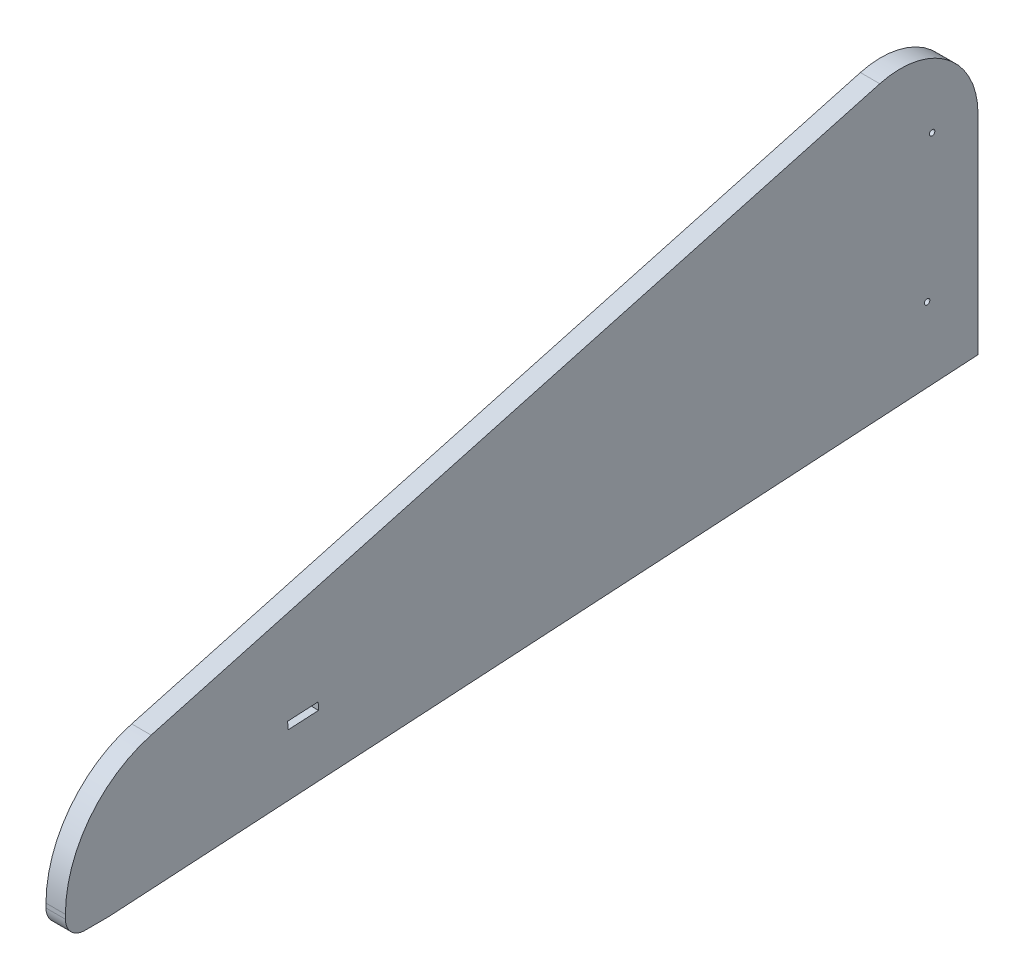
ISO-10303-21;
HEADER;
FILE_DESCRIPTION(('STEP AP214'),'2;1');
FILE_NAME('part.step','',(''),(''),'','','');
FILE_SCHEMA(('AUTOMOTIVE_DESIGN { 1 0 10303 214 1 1 1 1 }'));
ENDSEC;
DATA;
#1=APPLICATION_CONTEXT('core data for automotive mechanical design processes');
#2=APPLICATION_PROTOCOL_DEFINITION('international standard','automotive_design',2000,#1);
#3=PRODUCT_CONTEXT('',#1,'mechanical');
#4=PRODUCT('Part','Part','',(#3));
#5=PRODUCT_RELATED_PRODUCT_CATEGORY('part','',(#4));
#6=PRODUCT_DEFINITION_FORMATION('','',#4);
#7=PRODUCT_DEFINITION_CONTEXT('part definition',#1,'design');
#8=PRODUCT_DEFINITION('design','',#6,#7);
#9=PRODUCT_DEFINITION_SHAPE('','',#8);
#10=(LENGTH_UNIT() NAMED_UNIT(*) SI_UNIT(.MILLI.,.METRE.));
#11=(NAMED_UNIT(*) PLANE_ANGLE_UNIT() SI_UNIT($,.RADIAN.));
#12=(NAMED_UNIT(*) SI_UNIT($,.STERADIAN.) SOLID_ANGLE_UNIT());
#13=UNCERTAINTY_MEASURE_WITH_UNIT(LENGTH_MEASURE(1.E-05),#10,'distance_accuracy_value','');
#14=(GEOMETRIC_REPRESENTATION_CONTEXT(3) GLOBAL_UNCERTAINTY_ASSIGNED_CONTEXT((#13)) GLOBAL_UNIT_ASSIGNED_CONTEXT((#10,
#11,#12)) REPRESENTATION_CONTEXT('',''));
#15=CARTESIAN_POINT('',(0.,0.,0.));
#16=DIRECTION('',(0.,0.,1.));
#17=DIRECTION('',(1.,0.,0.));
#18=AXIS2_PLACEMENT_3D('',#15,#16,#17);
#19=CARTESIAN_POINT('',(12.7,47.5663935076045,60.2169087454711));
#20=DIRECTION('',(0.,0.964418030528148,0.264382038709531));
#21=DIRECTION('',(0.,-0.264382038709531,0.964418030528148));
#22=AXIS2_PLACEMENT_3D('',#19,#20,#21);
#23=PLANE('',#22);
#24=DIRECTION('',(0.,0.264382038709531,-0.964418030528148));
#25=VECTOR('',#24,1.);
#26=CARTESIAN_POINT('',(12.7,47.5663935076045,60.2169087454711));
#27=LINE('',#26,#25);
#28=CARTESIAN_POINT('',(12.7,62.9328567696654,4.16282009513737));
#29=VERTEX_POINT('',#28);
#30=CARTESIAN_POINT('',(12.7,193.56507563421,-472.359971906182));
#31=VERTEX_POINT('',#30);
#32=EDGE_CURVE('E233',#29,#31,#27,.T.);
#33=ORIENTED_EDGE('',*,*,#32,.T.);
#34=DIRECTION('',(-1.,0.,0.));
#35=VECTOR('',#34,1.);
#36=CARTESIAN_POINT('',(0.,193.56507563421,-472.359971906182));
#37=LINE('',#36,#35);
#38=CARTESIAN_POINT('',(0.,193.56507563421,-472.359971906182));
#39=VERTEX_POINT('',#38);
#40=EDGE_CURVE('E273',#31,#39,#37,.T.);
#41=ORIENTED_EDGE('',*,*,#40,.T.);
#42=DIRECTION('',(0.,0.264382038709531,-0.964418030528148));
#43=VECTOR('',#42,1.);
#44=CARTESIAN_POINT('',(0.,47.5663935076045,60.2169087454711));
#45=LINE('',#44,#43);
#46=CARTESIAN_POINT('',(0.,62.9328567696654,4.16282009513737));
#47=VERTEX_POINT('',#46);
#48=EDGE_CURVE('E232',#47,#39,#45,.T.);
#49=ORIENTED_EDGE('',*,*,#48,.F.);
#50=DIRECTION('',(-1.,0.,0.));
#51=VECTOR('',#50,1.);
#52=CARTESIAN_POINT('',(12.7,62.9328567696655,4.16282009513735));
#53=LINE('',#52,#51);
#54=EDGE_CURVE('E269',#47,#29,#53,.F.);
#55=ORIENTED_EDGE('',*,*,#54,.T.);
#56=EDGE_LOOP('',(#33,#41,#49,#55));
#57=FACE_BOUND('',#56,.T.);
#58=ADVANCED_FACE('F40',(#57),#23,.T.);
#59=CARTESIAN_POINT('',(12.7,47.5663935076045,60.2169087454711));
#60=DIRECTION('',(0.,0.,-1.));
#61=DIRECTION('',(0.,1.,0.));
#62=AXIS2_PLACEMENT_3D('',#59,#60,#61);
#63=PLANE('',#62);
#64=DIRECTION('',(0.,-1.,0.));
#65=VECTOR('',#64,1.);
#66=CARTESIAN_POINT('',(0.,47.5663935076045,60.2169087454711));
#67=LINE('',#66,#65);
#68=CARTESIAN_POINT('',(0.,-10.5557971565794,60.2169087454711));
#69=VERTEX_POINT('',#68);
#70=CARTESIAN_POINT('',(0.,-13.3344827586206,60.2169087454711));
#71=VERTEX_POINT('',#70);
#72=EDGE_CURVE('E237',#69,#71,#67,.T.);
#73=ORIENTED_EDGE('',*,*,#72,.T.);
#74=DIRECTION('',(-1.,0.,0.));
#75=VECTOR('',#74,1.);
#76=CARTESIAN_POINT('',(12.7,-13.3344827586206,60.2169087454711));
#77=LINE('',#76,#75);
#78=CARTESIAN_POINT('',(12.7,-13.3344827586206,60.2169087454711));
#79=VERTEX_POINT('',#78);
#80=EDGE_CURVE('E48',#71,#79,#77,.F.);
#81=ORIENTED_EDGE('',*,*,#80,.T.);
#82=DIRECTION('',(0.,-1.,0.));
#83=VECTOR('',#82,1.);
#84=CARTESIAN_POINT('',(12.7,47.5663935076045,60.2169087454711));
#85=LINE('',#84,#83);
#86=CARTESIAN_POINT('',(12.7,-10.5557971565794,60.2169087454711));
#87=VERTEX_POINT('',#86);
#88=EDGE_CURVE('E244',#87,#79,#85,.T.);
#89=ORIENTED_EDGE('',*,*,#88,.F.);
#90=DIRECTION('',(-1.,0.,0.));
#91=VECTOR('',#90,1.);
#92=CARTESIAN_POINT('',(0.,-10.5557971565794,60.2169087454711));
#93=LINE('',#92,#91);
#94=EDGE_CURVE('E262',#87,#69,#93,.T.);
#95=ORIENTED_EDGE('',*,*,#94,.T.);
#96=EDGE_LOOP('',(#73,#81,#89,#95));
#97=FACE_BOUND('',#96,.T.);
#98=ADVANCED_FACE('F289',(#97),#63,.F.);
#99=CARTESIAN_POINT('',(12.7,-26.0344827586206,60.2169087454711));
#100=DIRECTION('',(0.,1.,0.));
#101=DIRECTION('',(0.,0.,1.));
#102=AXIS2_PLACEMENT_3D('',#99,#100,#101);
#103=PLANE('',#102);
#104=DIRECTION('',(0.,0.,-1.));
#105=VECTOR('',#104,1.);
#106=CARTESIAN_POINT('',(12.7,-26.0344827586206,60.2169087454711));
#107=LINE('',#106,#105);
#108=CARTESIAN_POINT('',(12.7,-26.0344827586206,47.5169087454711));
#109=VERTEX_POINT('',#108);
#110=CARTESIAN_POINT('',(12.7,-26.0344827586206,31.9898367518973));
#111=VERTEX_POINT('',#110);
#112=EDGE_CURVE('E242',#109,#111,#107,.T.);
#113=ORIENTED_EDGE('',*,*,#112,.F.);
#114=DIRECTION('',(-1.,0.,0.));
#115=VECTOR('',#114,1.);
#116=CARTESIAN_POINT('',(12.7,-26.0344827586206,47.5169087454711));
#117=LINE('',#116,#115);
#118=CARTESIAN_POINT('',(0.,-26.0344827586206,47.5169087454711));
#119=VERTEX_POINT('',#118);
#120=EDGE_CURVE('E282',#109,#119,#117,.T.);
#121=ORIENTED_EDGE('',*,*,#120,.T.);
#122=DIRECTION('',(0.,0.,-1.));
#123=VECTOR('',#122,1.);
#124=CARTESIAN_POINT('',(0.,-26.0344827586206,60.2169087454711));
#125=LINE('',#124,#123);
#126=CARTESIAN_POINT('',(0.,-26.0344827586206,31.9898367518973));
#127=VERTEX_POINT('',#126);
#128=EDGE_CURVE('E255',#119,#127,#125,.T.);
#129=ORIENTED_EDGE('',*,*,#128,.T.);
#130=DIRECTION('',(-1.,0.,0.));
#131=VECTOR('',#130,1.);
#132=CARTESIAN_POINT('',(12.7,-26.0344827586206,31.9898367518973));
#133=LINE('',#132,#131);
#134=EDGE_CURVE('E259',#111,#127,#133,.T.);
#135=ORIENTED_EDGE('',*,*,#134,.F.);
#136=EDGE_LOOP('',(#113,#121,#129,#135));
#137=FACE_BOUND('',#136,.T.);
#138=ADVANCED_FACE('F302',(#137),#103,.F.);
#139=CARTESIAN_POINT('',(12.7,-26.0344827586206,31.9898367518973));
#140=DIRECTION('',(0.,0.998216092341354,0.0597045474880941));
#141=DIRECTION('',(0.,-0.0597045474880941,0.998216092341354));
#142=AXIS2_PLACEMENT_3D('',#139,#140,#141);
#143=PLANE('',#142);
#144=DIRECTION('',(0.,0.0597045474880941,-0.998216092341354));
#145=VECTOR('',#144,1.);
#146=CARTESIAN_POINT('',(0.,-26.0344827586206,31.9898367518973));
#147=LINE('',#146,#145);
#148=CARTESIAN_POINT('',(0.,7.97301994718511,-536.590579472626));
#149=VERTEX_POINT('',#148);
#150=EDGE_CURVE('E253',#127,#149,#147,.T.);
#151=ORIENTED_EDGE('',*,*,#150,.T.);
#152=DIRECTION('',(-1.,0.,0.));
#153=VECTOR('',#152,1.);
#154=CARTESIAN_POINT('',(12.7,7.97301994718511,-536.590579472626));
#155=LINE('',#154,#153);
#156=CARTESIAN_POINT('',(12.7,7.97301994718511,-536.590579472626));
#157=VERTEX_POINT('',#156);
#158=EDGE_CURVE('E247',#157,#149,#155,.T.);
#159=ORIENTED_EDGE('',*,*,#158,.F.);
#160=DIRECTION('',(0.,0.0597045474880941,-0.998216092341354));
#161=VECTOR('',#160,1.);
#162=CARTESIAN_POINT('',(12.7,-26.0344827586206,31.9898367518973));
#163=LINE('',#162,#161);
#164=EDGE_CURVE('E240',#111,#157,#163,.T.);
#165=ORIENTED_EDGE('',*,*,#164,.F.);
#166=ORIENTED_EDGE('',*,*,#134,.T.);
#167=EDGE_LOOP('',(#151,#159,#165,#166));
#168=FACE_BOUND('',#167,.T.);
#169=ADVANCED_FACE('F310',(#168),#143,.F.);
#170=CARTESIAN_POINT('',(12.7,7.97301994718511,-536.590579472626));
#171=DIRECTION('',(0.,0.,1.));
#172=DIRECTION('',(1.,0.,0.));
#173=AXIS2_PLACEMENT_3D('',#170,#171,#172);
#174=PLANE('',#173);
#175=DIRECTION('',(0.,1.,0.));
#176=VECTOR('',#175,1.);
#177=CARTESIAN_POINT('',(0.,7.97301994718511,-536.590579472626));
#178=LINE('',#177,#176);
#179=CARTESIAN_POINT('',(0.,144.572639683381,-536.590579472626));
#180=VERTEX_POINT('',#179);
#181=EDGE_CURVE('E250',#149,#180,#178,.T.);
#182=ORIENTED_EDGE('',*,*,#181,.T.);
#183=DIRECTION('',(-1.,0.,0.));
#184=VECTOR('',#183,1.);
#185=CARTESIAN_POINT('',(12.7,144.572639683381,-536.590579472626));
#186=LINE('',#185,#184);
#187=CARTESIAN_POINT('',(12.7,144.572639683381,-536.590579472626));
#188=VERTEX_POINT('',#187);
#189=EDGE_CURVE('E278',#180,#188,#186,.F.);
#190=ORIENTED_EDGE('',*,*,#189,.T.);
#191=DIRECTION('',(0.,1.,0.));
#192=VECTOR('',#191,1.);
#193=CARTESIAN_POINT('',(12.7,7.97301994718511,-536.590579472626));
#194=LINE('',#193,#192);
#195=EDGE_CURVE('E236',#157,#188,#194,.T.);
#196=ORIENTED_EDGE('',*,*,#195,.F.);
#197=ORIENTED_EDGE('',*,*,#158,.T.);
#198=EDGE_LOOP('',(#182,#190,#196,#197));
#199=FACE_BOUND('',#198,.T.);
#200=ADVANCED_FACE('F314',(#199),#174,.F.);
#201=CARTESIAN_POINT('',(12.7,0.,0.));
#202=DIRECTION('',(1.,0.,0.));
#203=DIRECTION('',(0.,0.,-1.));
#204=AXIS2_PLACEMENT_3D('',#201,#202,#203);
#205=PLANE('',#204);
#206=DIRECTION('',(0.,0.998629534754574,0.0523359562429437));
#207=VECTOR('',#206,1.);
#208=CARTESIAN_POINT('',(12.7,27.164368218538,-105.083340122295));
#209=LINE('',#208,#207);
#210=CARTESIAN_POINT('',(12.7,22.1712205447651,-105.345019903509));
#211=VERTEX_POINT('',#210);
#212=CARTESIAN_POINT('',(12.7,27.164368218538,-105.083340122295));
#213=VERTEX_POINT('',#212);
#214=EDGE_CURVE('E63',#211,#213,#209,.T.);
#215=ORIENTED_EDGE('',*,*,#214,.F.);
#216=DIRECTION('',(0.,0.0523359562429439,-0.998629534754574));
#217=VECTOR('',#216,1.);
#218=CARTESIAN_POINT('',(12.7,21.1245014199063,-85.372429208418));
#219=LINE('',#218,#217);
#220=CARTESIAN_POINT('',(12.7,21.1245014199063,-85.372429208418));
#221=VERTEX_POINT('',#220);
#222=EDGE_CURVE('E194',#221,#211,#219,.T.);
#223=ORIENTED_EDGE('',*,*,#222,.F.);
#224=DIRECTION('',(0.,-0.998629534754574,-0.0523359562429409));
#225=VECTOR('',#224,1.);
#226=CARTESIAN_POINT('',(12.7,26.1176490936791,-85.1107494272033));
#227=LINE('',#226,#225);
#228=CARTESIAN_POINT('',(12.7,26.1176490936791,-85.1107494272033));
#229=VERTEX_POINT('',#228);
#230=EDGE_CURVE('E208',#229,#221,#227,.T.);
#231=ORIENTED_EDGE('',*,*,#230,.F.);
#232=DIRECTION('',(0.,-0.0523359562429439,0.998629534754574));
#233=VECTOR('',#232,1.);
#234=CARTESIAN_POINT('',(12.7,26.1176490936791,-85.1107494272033));
#235=LINE('',#234,#233);
#236=EDGE_CURVE('E205',#213,#229,#235,.T.);
#237=ORIENTED_EDGE('',*,*,#236,.F.);
#238=EDGE_LOOP('',(#215,#223,#231,#237));
#239=FACE_BOUND('',#238,.T.);
#240=CARTESIAN_POINT('',(12.7,148.702123969423,-506.618579472626));
#241=DIRECTION('',(1.,0.,0.));
#242=DIRECTION('',(0.,0.,-1.));
#243=AXIS2_PLACEMENT_3D('',#240,#241,#242);
#244=CIRCLE('',#243,1.77799999999998);
#245=CARTESIAN_POINT('',(12.7,148.702123969423,-508.396579472626));
#246=VERTEX_POINT('',#245);
#247=EDGE_CURVE('E223',#246,#246,#244,.F.);
#248=ORIENTED_EDGE('',*,*,#247,.T.);
#249=EDGE_LOOP('',(#248));
#250=FACE_BOUND('',#249,.T.);
#251=CARTESIAN_POINT('',(12.7,54.5835597329637,-503.316579472626));
#252=DIRECTION('',(1.,0.,0.));
#253=DIRECTION('',(0.,0.,-1.));
#254=AXIS2_PLACEMENT_3D('',#251,#252,#253);
#255=CIRCLE('',#254,1.77799999999997);
#256=CARTESIAN_POINT('',(12.7,54.5835597329637,-505.094579472626));
#257=VERTEX_POINT('',#256);
#258=EDGE_CURVE('E229',#257,#257,#255,.F.);
#259=ORIENTED_EDGE('',*,*,#258,.T.);
#260=EDGE_LOOP('',(#259));
#261=FACE_BOUND('',#260,.T.);
#262=ORIENTED_EDGE('',*,*,#88,.T.);
#263=CARTESIAN_POINT('',(12.7,-13.3344827586206,47.5169087454711));
#264=DIRECTION('',(1.,0.,0.));
#265=DIRECTION('',(0.,0.,-1.));
#266=AXIS2_PLACEMENT_3D('',#263,#264,#265);
#267=CIRCLE('',#266,12.7);
#268=EDGE_CURVE('E11',#79,#109,#267,.T.);
#269=ORIENTED_EDGE('',*,*,#268,.T.);
#270=ORIENTED_EDGE('',*,*,#112,.T.);
#271=ORIENTED_EDGE('',*,*,#164,.T.);
#272=ORIENTED_EDGE('',*,*,#195,.T.);
#273=CARTESIAN_POINT('',(12.7,144.572639683381,-485.790579472626));
#274=DIRECTION('',(1.,0.,0.));
#275=DIRECTION('',(0.,0.,-1.));
#276=AXIS2_PLACEMENT_3D('',#273,#274,#275);
#277=CIRCLE('',#276,50.8);
#278=EDGE_CURVE('E280',#188,#31,#277,.T.);
#279=ORIENTED_EDGE('',*,*,#278,.T.);
#280=ORIENTED_EDGE('',*,*,#32,.F.);
#281=CARTESIAN_POINT('',(12.7,-10.5557971565794,-15.9830912545289));
#282=DIRECTION('',(1.,0.,0.));
#283=DIRECTION('',(0.,0.,-1.));
#284=AXIS2_PLACEMENT_3D('',#281,#282,#283);
#285=CIRCLE('',#284,76.2);
#286=EDGE_CURVE('E271',#29,#87,#285,.T.);
#287=ORIENTED_EDGE('',*,*,#286,.T.);
#288=EDGE_LOOP('',(#262,#269,#270,#271,#272,#279,#280,#287));
#289=FACE_BOUND('',#288,.T.);
#290=ADVANCED_FACE('F295',(#239,#250,#261,#289),#205,.T.);
#291=CARTESIAN_POINT('',(0.,0.,0.));
#292=DIRECTION('',(1.,0.,0.));
#293=DIRECTION('',(0.,0.,-1.));
#294=AXIS2_PLACEMENT_3D('',#291,#292,#293);
#295=PLANE('',#294);
#296=DIRECTION('',(0.,0.998629534754574,0.0523359562429409));
#297=VECTOR('',#296,1.);
#298=CARTESIAN_POINT('',(0.,26.1176490936791,-85.1107494272033));
#299=LINE('',#298,#297);
#300=CARTESIAN_POINT('',(0.,21.1245014199063,-85.372429208418));
#301=VERTEX_POINT('',#300);
#302=CARTESIAN_POINT('',(0.,26.1176490936791,-85.1107494272033));
#303=VERTEX_POINT('',#302);
#304=EDGE_CURVE('E181',#301,#303,#299,.T.);
#305=ORIENTED_EDGE('',*,*,#304,.F.);
#306=DIRECTION('',(0.,-0.0523359562429439,0.998629534754574));
#307=VECTOR('',#306,1.);
#308=CARTESIAN_POINT('',(0.,21.1245014199063,-85.372429208418));
#309=LINE('',#308,#307);
#310=CARTESIAN_POINT('',(0.,22.1712205447651,-105.345019903509));
#311=VERTEX_POINT('',#310);
#312=EDGE_CURVE('E55',#311,#301,#309,.T.);
#313=ORIENTED_EDGE('',*,*,#312,.F.);
#314=DIRECTION('',(0.,-0.998629534754574,-0.0523359562429437));
#315=VECTOR('',#314,1.);
#316=CARTESIAN_POINT('',(0.,22.1712205447651,-105.345019903509));
#317=LINE('',#316,#315);
#318=CARTESIAN_POINT('',(0.,27.164368218538,-105.083340122295));
#319=VERTEX_POINT('',#318);
#320=EDGE_CURVE('E172',#319,#311,#317,.T.);
#321=ORIENTED_EDGE('',*,*,#320,.F.);
#322=DIRECTION('',(0.,0.0523359562429441,-0.998629534754574));
#323=VECTOR('',#322,1.);
#324=CARTESIAN_POINT('',(0.,27.164368218538,-105.083340122295));
#325=LINE('',#324,#323);
#326=EDGE_CURVE('E175',#303,#319,#325,.T.);
#327=ORIENTED_EDGE('',*,*,#326,.F.);
#328=EDGE_LOOP('',(#305,#313,#321,#327));
#329=FACE_BOUND('',#328,.T.);
#330=CARTESIAN_POINT('',(0.,148.702123969423,-506.618579472626));
#331=DIRECTION('',(1.,0.,0.));
#332=DIRECTION('',(0.,0.,-1.));
#333=AXIS2_PLACEMENT_3D('',#330,#331,#332);
#334=CIRCLE('',#333,1.77799999999998);
#335=CARTESIAN_POINT('',(0.,148.702123969423,-508.396579472626));
#336=VERTEX_POINT('',#335);
#337=EDGE_CURVE('E215',#336,#336,#334,.T.);
#338=ORIENTED_EDGE('',*,*,#337,.T.);
#339=EDGE_LOOP('',(#338));
#340=FACE_BOUND('',#339,.T.);
#341=CARTESIAN_POINT('',(0.,54.5835597329637,-503.316579472626));
#342=DIRECTION('',(1.,0.,0.));
#343=DIRECTION('',(0.,0.,-1.));
#344=AXIS2_PLACEMENT_3D('',#341,#342,#343);
#345=CIRCLE('',#344,1.77799999999997);
#346=CARTESIAN_POINT('',(0.,54.5835597329637,-505.094579472626));
#347=VERTEX_POINT('',#346);
#348=EDGE_CURVE('E226',#347,#347,#345,.T.);
#349=ORIENTED_EDGE('',*,*,#348,.T.);
#350=EDGE_LOOP('',(#349));
#351=FACE_BOUND('',#350,.T.);
#352=ORIENTED_EDGE('',*,*,#128,.F.);
#353=CARTESIAN_POINT('',(0.,-13.3344827586206,47.5169087454711));
#354=DIRECTION('',(1.,0.,0.));
#355=DIRECTION('',(0.,0.,-1.));
#356=AXIS2_PLACEMENT_3D('',#353,#354,#355);
#357=CIRCLE('',#356,12.7);
#358=EDGE_CURVE('E285',#119,#71,#357,.F.);
#359=ORIENTED_EDGE('',*,*,#358,.T.);
#360=ORIENTED_EDGE('',*,*,#72,.F.);
#361=CARTESIAN_POINT('',(0.,-10.5557971565794,-15.9830912545289));
#362=DIRECTION('',(1.,0.,0.));
#363=DIRECTION('',(0.,0.,-1.));
#364=AXIS2_PLACEMENT_3D('',#361,#362,#363);
#365=CIRCLE('',#364,76.2);
#366=EDGE_CURVE('E267',#69,#47,#365,.F.);
#367=ORIENTED_EDGE('',*,*,#366,.T.);
#368=ORIENTED_EDGE('',*,*,#48,.T.);
#369=CARTESIAN_POINT('',(0.,144.572639683381,-485.790579472626));
#370=DIRECTION('',(1.,0.,0.));
#371=DIRECTION('',(0.,0.,-1.));
#372=AXIS2_PLACEMENT_3D('',#369,#370,#371);
#373=CIRCLE('',#372,50.8);
#374=EDGE_CURVE('E276',#39,#180,#373,.F.);
#375=ORIENTED_EDGE('',*,*,#374,.T.);
#376=ORIENTED_EDGE('',*,*,#181,.F.);
#377=ORIENTED_EDGE('',*,*,#150,.F.);
#378=EDGE_LOOP('',(#352,#359,#360,#367,#368,#375,#376,#377));
#379=FACE_BOUND('',#378,.T.);
#380=ADVANCED_FACE('F306',(#329,#340,#351,#379),#295,.F.);
#381=CARTESIAN_POINT('',(12.7,-10.5557971565794,-15.9830912545289));
#382=DIRECTION('',(1.,0.,0.));
#383=DIRECTION('',(0.,0.,-1.));
#384=AXIS2_PLACEMENT_3D('',#381,#382,#383);
#385=CYLINDRICAL_SURFACE('',#384,76.2);
#386=ORIENTED_EDGE('',*,*,#286,.F.);
#387=ORIENTED_EDGE('',*,*,#54,.F.);
#388=ORIENTED_EDGE('',*,*,#366,.F.);
#389=ORIENTED_EDGE('',*,*,#94,.F.);
#390=EDGE_LOOP('',(#386,#387,#388,#389));
#391=FACE_BOUND('',#390,.T.);
#392=ADVANCED_FACE('F324',(#391),#385,.T.);
#393=CARTESIAN_POINT('',(12.7,144.572639683381,-485.790579472626));
#394=DIRECTION('',(1.,0.,0.));
#395=DIRECTION('',(0.,0.,-1.));
#396=AXIS2_PLACEMENT_3D('',#393,#394,#395);
#397=CYLINDRICAL_SURFACE('',#396,50.8);
#398=ORIENTED_EDGE('',*,*,#278,.F.);
#399=ORIENTED_EDGE('',*,*,#189,.F.);
#400=ORIENTED_EDGE('',*,*,#374,.F.);
#401=ORIENTED_EDGE('',*,*,#40,.F.);
#402=EDGE_LOOP('',(#398,#399,#400,#401));
#403=FACE_BOUND('',#402,.T.);
#404=ADVANCED_FACE('F319',(#403),#397,.T.);
#405=CARTESIAN_POINT('',(12.7,-13.3344827586206,47.5169087454711));
#406=DIRECTION('',(-1.,0.,0.));
#407=DIRECTION('',(0.,0.,1.));
#408=AXIS2_PLACEMENT_3D('',#405,#406,#407);
#409=CYLINDRICAL_SURFACE('',#408,12.7);
#410=ORIENTED_EDGE('',*,*,#268,.F.);
#411=ORIENTED_EDGE('',*,*,#80,.F.);
#412=ORIENTED_EDGE('',*,*,#358,.F.);
#413=ORIENTED_EDGE('',*,*,#120,.F.);
#414=EDGE_LOOP('',(#410,#411,#412,#413));
#415=FACE_BOUND('',#414,.T.);
#416=ADVANCED_FACE('F42',(#415),#409,.T.);
#417=CARTESIAN_POINT('',(32.004,54.5835597329637,-503.316579472626));
#418=DIRECTION('',(-1.,0.,0.));
#419=DIRECTION('',(0.,0.,1.));
#420=AXIS2_PLACEMENT_3D('',#417,#418,#419);
#421=CYLINDRICAL_SURFACE('',#420,1.77799999999997);
#422=ORIENTED_EDGE('',*,*,#258,.F.);
#423=EDGE_LOOP('',(#422));
#424=FACE_BOUND('',#423,.T.);
#425=ORIENTED_EDGE('',*,*,#348,.F.);
#426=EDGE_LOOP('',(#425));
#427=FACE_BOUND('',#426,.T.);
#428=ADVANCED_FACE('F350',(#424,#427),#421,.F.);
#429=CARTESIAN_POINT('',(19.304,148.702123969423,-506.618579472626));
#430=DIRECTION('',(-1.,0.,0.));
#431=DIRECTION('',(0.,0.,1.));
#432=AXIS2_PLACEMENT_3D('',#429,#430,#431);
#433=CYLINDRICAL_SURFACE('',#432,1.77799999999998);
#434=ORIENTED_EDGE('',*,*,#247,.F.);
#435=EDGE_LOOP('',(#434));
#436=FACE_BOUND('',#435,.T.);
#437=ORIENTED_EDGE('',*,*,#337,.F.);
#438=EDGE_LOOP('',(#437));
#439=FACE_BOUND('',#438,.T.);
#440=ADVANCED_FACE('F353',(#436,#439),#433,.F.);
#441=CARTESIAN_POINT('',(7.7,27.164368218538,-105.083340122295));
#442=DIRECTION('',(0.,0.0523359562429437,-0.998629534754574));
#443=DIRECTION('',(0.,0.998629534754574,0.0523359562429437));
#444=AXIS2_PLACEMENT_3D('',#441,#442,#443);
#445=PLANE('',#444);
#446=ORIENTED_EDGE('',*,*,#214,.T.);
#447=DIRECTION('',(1.,0.,0.));
#448=VECTOR('',#447,1.);
#449=CARTESIAN_POINT('',(7.7,27.164368218538,-105.083340122295));
#450=LINE('',#449,#448);
#451=CARTESIAN_POINT('',(7.7,27.164368218538,-105.083340122295));
#452=VERTEX_POINT('',#451);
#453=EDGE_CURVE('E203',#452,#213,#450,.T.);
#454=ORIENTED_EDGE('',*,*,#453,.F.);
#455=DIRECTION('',(0.,0.998629534754574,0.0523359562429437));
#456=VECTOR('',#455,1.);
#457=CARTESIAN_POINT('',(7.7,27.164368218538,-105.083340122295));
#458=LINE('',#457,#456);
#459=CARTESIAN_POINT('',(7.7,22.1712205447651,-105.345019903509));
#460=VERTEX_POINT('',#459);
#461=EDGE_CURVE('E190',#460,#452,#458,.T.);
#462=ORIENTED_EDGE('',*,*,#461,.F.);
#463=DIRECTION('',(1.,0.,0.));
#464=VECTOR('',#463,1.);
#465=CARTESIAN_POINT('',(7.7,22.1712205447651,-105.345019903509));
#466=LINE('',#465,#464);
#467=EDGE_CURVE('E213',#460,#211,#466,.T.);
#468=ORIENTED_EDGE('',*,*,#467,.T.);
#469=EDGE_LOOP('',(#446,#454,#462,#468));
#470=FACE_BOUND('',#469,.T.);
#471=ADVANCED_FACE('F357',(#470),#445,.F.);
#472=CARTESIAN_POINT('',(7.7,21.1245014199063,-85.372429208418));
#473=DIRECTION('',(0.,-0.998629534754574,-0.0523359562429439));
#474=DIRECTION('',(0.,0.0523359562429439,-0.998629534754574));
#475=AXIS2_PLACEMENT_3D('',#472,#473,#474);
#476=PLANE('',#475);
#477=ORIENTED_EDGE('',*,*,#222,.T.);
#478=ORIENTED_EDGE('',*,*,#467,.F.);
#479=DIRECTION('',(0.,0.0523359562429439,-0.998629534754574));
#480=VECTOR('',#479,1.);
#481=CARTESIAN_POINT('',(7.7,21.1245014199063,-85.372429208418));
#482=LINE('',#481,#480);
#483=CARTESIAN_POINT('',(7.7,21.1245014199063,-85.372429208418));
#484=VERTEX_POINT('',#483);
#485=EDGE_CURVE('E200',#484,#460,#482,.T.);
#486=ORIENTED_EDGE('',*,*,#485,.F.);
#487=DIRECTION('',(1.,0.,0.));
#488=VECTOR('',#487,1.);
#489=CARTESIAN_POINT('',(7.7,21.1245014199063,-85.372429208418));
#490=LINE('',#489,#488);
#491=EDGE_CURVE('E216',#484,#221,#490,.T.);
#492=ORIENTED_EDGE('',*,*,#491,.T.);
#493=EDGE_LOOP('',(#477,#478,#486,#492));
#494=FACE_BOUND('',#493,.T.);
#495=ADVANCED_FACE('F361',(#494),#476,.F.);
#496=CARTESIAN_POINT('',(7.7,26.1176490936791,-85.1107494272033));
#497=DIRECTION('',(0.,-0.0523359562429409,0.998629534754574));
#498=DIRECTION('',(0.,-0.998629534754574,-0.0523359562429409));
#499=AXIS2_PLACEMENT_3D('',#496,#497,#498);
#500=PLANE('',#499);
#501=ORIENTED_EDGE('',*,*,#230,.T.);
#502=ORIENTED_EDGE('',*,*,#491,.F.);
#503=DIRECTION('',(0.,-0.998629534754574,-0.0523359562429409));
#504=VECTOR('',#503,1.);
#505=CARTESIAN_POINT('',(7.7,26.1176490936791,-85.1107494272033));
#506=LINE('',#505,#504);
#507=CARTESIAN_POINT('',(7.7,26.1176490936791,-85.1107494272033));
#508=VERTEX_POINT('',#507);
#509=EDGE_CURVE('E197',#508,#484,#506,.T.);
#510=ORIENTED_EDGE('',*,*,#509,.F.);
#511=DIRECTION('',(1.,0.,0.));
#512=VECTOR('',#511,1.);
#513=CARTESIAN_POINT('',(7.7,26.1176490936791,-85.1107494272033));
#514=LINE('',#513,#512);
#515=EDGE_CURVE('E218',#508,#229,#514,.T.);
#516=ORIENTED_EDGE('',*,*,#515,.T.);
#517=EDGE_LOOP('',(#501,#502,#510,#516));
#518=FACE_BOUND('',#517,.T.);
#519=ADVANCED_FACE('F366',(#518),#500,.F.);
#520=CARTESIAN_POINT('',(7.7,26.1176490936791,-85.1107494272033));
#521=DIRECTION('',(0.,0.998629534754574,0.0523359562429439));
#522=DIRECTION('',(0.,-0.0523359562429439,0.998629534754574));
#523=AXIS2_PLACEMENT_3D('',#520,#521,#522);
#524=PLANE('',#523);
#525=ORIENTED_EDGE('',*,*,#236,.T.);
#526=ORIENTED_EDGE('',*,*,#515,.F.);
#527=DIRECTION('',(0.,-0.0523359562429439,0.998629534754574));
#528=VECTOR('',#527,1.);
#529=CARTESIAN_POINT('',(7.7,26.1176490936791,-85.1107494272033));
#530=LINE('',#529,#528);
#531=EDGE_CURVE('E193',#452,#508,#530,.T.);
#532=ORIENTED_EDGE('',*,*,#531,.F.);
#533=ORIENTED_EDGE('',*,*,#453,.T.);
#534=EDGE_LOOP('',(#525,#526,#532,#533));
#535=FACE_BOUND('',#534,.T.);
#536=ADVANCED_FACE('F362',(#535),#524,.F.);
#537=CARTESIAN_POINT('',(7.7,0.,0.));
#538=DIRECTION('',(1.,0.,0.));
#539=DIRECTION('',(0.,0.,-1.));
#540=AXIS2_PLACEMENT_3D('',#537,#538,#539);
#541=PLANE('',#540);
#542=ORIENTED_EDGE('',*,*,#461,.T.);
#543=ORIENTED_EDGE('',*,*,#531,.T.);
#544=ORIENTED_EDGE('',*,*,#509,.T.);
#545=ORIENTED_EDGE('',*,*,#485,.T.);
#546=EDGE_LOOP('',(#542,#543,#544,#545));
#547=FACE_BOUND('',#546,.T.);
#548=ADVANCED_FACE('F365',(#547),#541,.T.);
#549=CARTESIAN_POINT('',(5.,21.1245014199063,-85.372429208418));
#550=DIRECTION('',(0.,-0.998629534754574,-0.0523359562429439));
#551=DIRECTION('',(0.,0.0523359562429439,-0.998629534754574));
#552=AXIS2_PLACEMENT_3D('',#549,#550,#551);
#553=PLANE('',#552);
#554=ORIENTED_EDGE('',*,*,#312,.T.);
#555=DIRECTION('',(-1.,0.,0.));
#556=VECTOR('',#555,1.);
#557=CARTESIAN_POINT('',(5.,21.1245014199063,-85.372429208418));
#558=LINE('',#557,#556);
#559=CARTESIAN_POINT('',(5.,21.1245014199063,-85.372429208418));
#560=VERTEX_POINT('',#559);
#561=EDGE_CURVE('E150',#560,#301,#558,.T.);
#562=ORIENTED_EDGE('',*,*,#561,.F.);
#563=DIRECTION('',(0.,-0.0523359562429439,0.998629534754574));
#564=VECTOR('',#563,1.);
#565=CARTESIAN_POINT('',(5.,21.1245014199063,-85.372429208418));
#566=LINE('',#565,#564);
#567=CARTESIAN_POINT('',(5.,22.1712205447651,-105.345019903509));
#568=VERTEX_POINT('',#567);
#569=EDGE_CURVE('E154',#568,#560,#566,.T.);
#570=ORIENTED_EDGE('',*,*,#569,.F.);
#571=DIRECTION('',(-1.,0.,0.));
#572=VECTOR('',#571,1.);
#573=CARTESIAN_POINT('',(5.,22.1712205447651,-105.345019903509));
#574=LINE('',#573,#572);
#575=EDGE_CURVE('E185',#568,#311,#574,.T.);
#576=ORIENTED_EDGE('',*,*,#575,.T.);
#577=EDGE_LOOP('',(#554,#562,#570,#576));
#578=FACE_BOUND('',#577,.T.);
#579=ADVANCED_FACE('F152',(#578),#553,.F.);
#580=CARTESIAN_POINT('',(5.,22.1712205447651,-105.345019903509));
#581=DIRECTION('',(0.,0.0523359562429437,-0.998629534754574));
#582=DIRECTION('',(0.,0.998629534754574,0.0523359562429437));
#583=AXIS2_PLACEMENT_3D('',#580,#581,#582);
#584=PLANE('',#583);
#585=ORIENTED_EDGE('',*,*,#320,.T.);
#586=ORIENTED_EDGE('',*,*,#575,.F.);
#587=DIRECTION('',(0.,-0.998629534754574,-0.0523359562429437));
#588=VECTOR('',#587,1.);
#589=CARTESIAN_POINT('',(5.,22.1712205447651,-105.345019903509));
#590=LINE('',#589,#588);
#591=CARTESIAN_POINT('',(5.,27.164368218538,-105.083340122295));
#592=VERTEX_POINT('',#591);
#593=EDGE_CURVE('E160',#592,#568,#590,.T.);
#594=ORIENTED_EDGE('',*,*,#593,.F.);
#595=DIRECTION('',(-1.,0.,0.));
#596=VECTOR('',#595,1.);
#597=CARTESIAN_POINT('',(5.,27.164368218538,-105.083340122295));
#598=LINE('',#597,#596);
#599=EDGE_CURVE('E187',#592,#319,#598,.T.);
#600=ORIENTED_EDGE('',*,*,#599,.T.);
#601=EDGE_LOOP('',(#585,#586,#594,#600));
#602=FACE_BOUND('',#601,.T.);
#603=ADVANCED_FACE('F379',(#602),#584,.F.);
#604=CARTESIAN_POINT('',(5.,27.164368218538,-105.083340122295));
#605=DIRECTION('',(0.,0.998629534754574,0.0523359562429441));
#606=DIRECTION('',(0.,-0.0523359562429441,0.998629534754574));
#607=AXIS2_PLACEMENT_3D('',#604,#605,#606);
#608=PLANE('',#607);
#609=ORIENTED_EDGE('',*,*,#326,.T.);
#610=ORIENTED_EDGE('',*,*,#599,.F.);
#611=DIRECTION('',(0.,0.0523359562429441,-0.998629534754574));
#612=VECTOR('',#611,1.);
#613=CARTESIAN_POINT('',(5.,27.164368218538,-105.083340122295));
#614=LINE('',#613,#612);
#615=CARTESIAN_POINT('',(5.,26.1176490936791,-85.1107494272033));
#616=VERTEX_POINT('',#615);
#617=EDGE_CURVE('E168',#616,#592,#614,.T.);
#618=ORIENTED_EDGE('',*,*,#617,.F.);
#619=DIRECTION('',(-1.,0.,0.));
#620=VECTOR('',#619,1.);
#621=CARTESIAN_POINT('',(5.,26.1176490936791,-85.1107494272033));
#622=LINE('',#621,#620);
#623=EDGE_CURVE('E159',#616,#303,#622,.T.);
#624=ORIENTED_EDGE('',*,*,#623,.T.);
#625=EDGE_LOOP('',(#609,#610,#618,#624));
#626=FACE_BOUND('',#625,.T.);
#627=ADVANCED_FACE('F382',(#626),#608,.F.);
#628=CARTESIAN_POINT('',(5.,26.1176490936791,-85.1107494272033));
#629=DIRECTION('',(0.,-0.0523359562429409,0.998629534754574));
#630=DIRECTION('',(0.,-0.998629534754574,-0.0523359562429409));
#631=AXIS2_PLACEMENT_3D('',#628,#629,#630);
#632=PLANE('',#631);
#633=ORIENTED_EDGE('',*,*,#304,.T.);
#634=ORIENTED_EDGE('',*,*,#623,.F.);
#635=DIRECTION('',(0.,0.998629534754574,0.0523359562429409));
#636=VECTOR('',#635,1.);
#637=CARTESIAN_POINT('',(5.,26.1176490936791,-85.1107494272033));
#638=LINE('',#637,#636);
#639=EDGE_CURVE('E163',#560,#616,#638,.T.);
#640=ORIENTED_EDGE('',*,*,#639,.F.);
#641=ORIENTED_EDGE('',*,*,#561,.T.);
#642=EDGE_LOOP('',(#633,#634,#640,#641));
#643=FACE_BOUND('',#642,.T.);
#644=ADVANCED_FACE('F164',(#643),#632,.F.);
#645=CARTESIAN_POINT('',(5.,0.,0.));
#646=DIRECTION('',(1.,0.,0.));
#647=DIRECTION('',(0.,0.,-1.));
#648=AXIS2_PLACEMENT_3D('',#645,#646,#647);
#649=PLANE('',#648);
#650=ORIENTED_EDGE('',*,*,#569,.T.);
#651=ORIENTED_EDGE('',*,*,#639,.T.);
#652=ORIENTED_EDGE('',*,*,#617,.T.);
#653=ORIENTED_EDGE('',*,*,#593,.T.);
#654=EDGE_LOOP('',(#650,#651,#652,#653));
#655=FACE_BOUND('',#654,.T.);
#656=ADVANCED_FACE('F170',(#655),#649,.F.);
#657=CLOSED_SHELL('',(#58,#98,#138,#169,#200,#290,#380,#392,#404,#416,#428,#440,#471,#495,#519,
#536,#548,#579,#603,#627,#644,#656));
#658=MANIFOLD_SOLID_BREP('B2',#657);
#659=ADVANCED_BREP_SHAPE_REPRESENTATION('',(#18,#658),#14);
#660=SHAPE_DEFINITION_REPRESENTATION(#9,#659);
ENDSEC;
END-ISO-10303-21;
